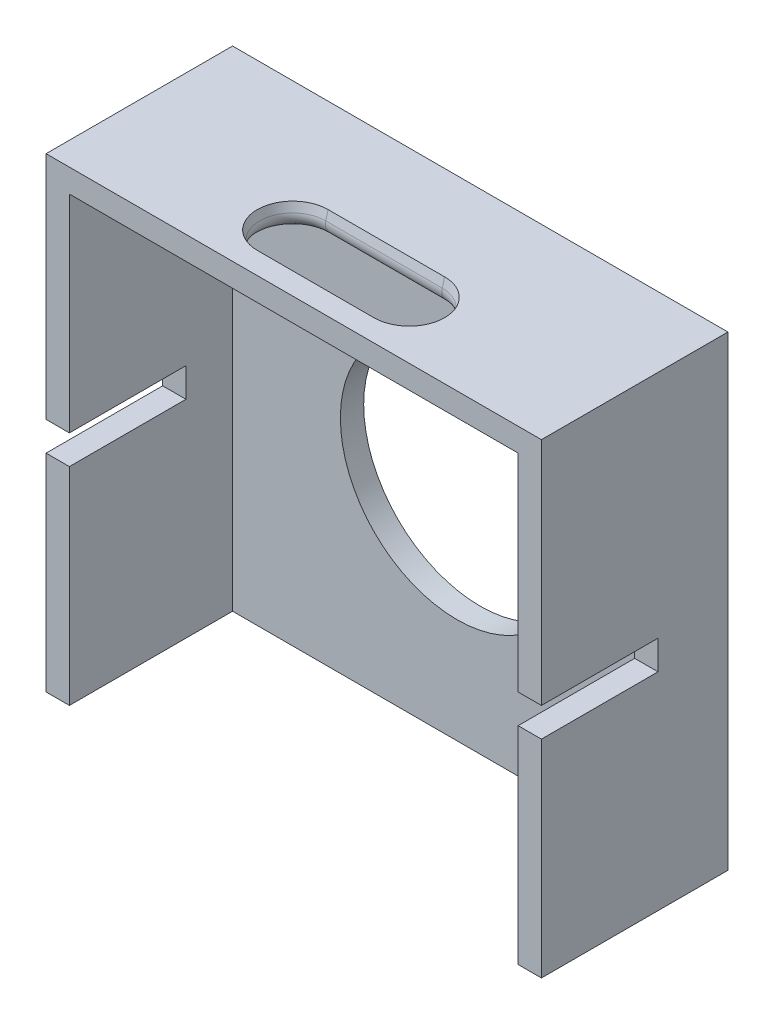
ISO-10303-21;
HEADER;
FILE_DESCRIPTION(('STEP AP214'),'2;1');
FILE_NAME('part.step','',(''),(''),'','','');
FILE_SCHEMA(('AUTOMOTIVE_DESIGN { 1 0 10303 214 1 1 1 1 }'));
ENDSEC;
DATA;
#1=APPLICATION_CONTEXT('core data for automotive mechanical design processes');
#2=APPLICATION_PROTOCOL_DEFINITION('international standard','automotive_design',2000,#1);
#3=PRODUCT_CONTEXT('',#1,'mechanical');
#4=PRODUCT('Part','Part','',(#3));
#5=PRODUCT_RELATED_PRODUCT_CATEGORY('part','',(#4));
#6=PRODUCT_DEFINITION_FORMATION('','',#4);
#7=PRODUCT_DEFINITION_CONTEXT('part definition',#1,'design');
#8=PRODUCT_DEFINITION('design','',#6,#7);
#9=PRODUCT_DEFINITION_SHAPE('','',#8);
#10=(LENGTH_UNIT() NAMED_UNIT(*) SI_UNIT(.MILLI.,.METRE.));
#11=(NAMED_UNIT(*) PLANE_ANGLE_UNIT() SI_UNIT($,.RADIAN.));
#12=(NAMED_UNIT(*) SI_UNIT($,.STERADIAN.) SOLID_ANGLE_UNIT());
#13=UNCERTAINTY_MEASURE_WITH_UNIT(LENGTH_MEASURE(1.E-05),#10,'distance_accuracy_value','');
#14=(GEOMETRIC_REPRESENTATION_CONTEXT(3) GLOBAL_UNCERTAINTY_ASSIGNED_CONTEXT((#13)) GLOBAL_UNIT_ASSIGNED_CONTEXT((#10,
#11,#12)) REPRESENTATION_CONTEXT('',''));
#15=CARTESIAN_POINT('',(0.,0.,0.));
#16=DIRECTION('',(0.,0.,1.));
#17=DIRECTION('',(1.,0.,0.));
#18=AXIS2_PLACEMENT_3D('',#15,#16,#17);
#19=CARTESIAN_POINT('',(19.25,0.,-58.3630876496438));
#20=DIRECTION('',(1.,0.,0.));
#21=DIRECTION('',(0.,1.,0.));
#22=AXIS2_PLACEMENT_3D('',#19,#20,#21);
#23=PLANE('',#22);
#24=DIRECTION('',(0.,0.,1.));
#25=VECTOR('',#24,1.);
#26=CARTESIAN_POINT('',(19.25,1.25,6.));
#27=LINE('',#26,#25);
#28=CARTESIAN_POINT('',(19.25,1.25,6.));
#29=VERTEX_POINT('',#28);
#30=CARTESIAN_POINT('',(19.25,1.25,16.));
#31=VERTEX_POINT('',#30);
#32=EDGE_CURVE('E229',#29,#31,#27,.T.);
#33=ORIENTED_EDGE('',*,*,#32,.T.);
#34=DIRECTION('',(0.,1.,0.));
#35=VECTOR('',#34,1.);
#36=CARTESIAN_POINT('',(19.25,0.,16.));
#37=LINE('',#36,#35);
#38=CARTESIAN_POINT('',(19.25,19.,16.));
#39=VERTEX_POINT('',#38);
#40=EDGE_CURVE('E272',#31,#39,#37,.T.);
#41=ORIENTED_EDGE('',*,*,#40,.T.);
#42=DIRECTION('',(0.,0.,1.));
#43=VECTOR('',#42,1.);
#44=CARTESIAN_POINT('',(19.25,19.,-58.3630876496438));
#45=LINE('',#44,#43);
#46=CARTESIAN_POINT('',(19.25,19.,2.));
#47=VERTEX_POINT('',#46);
#48=EDGE_CURVE('E297',#47,#39,#45,.T.);
#49=ORIENTED_EDGE('',*,*,#48,.F.);
#50=DIRECTION('',(0.,-1.,0.));
#51=VECTOR('',#50,1.);
#52=CARTESIAN_POINT('',(19.25,0.,2.));
#53=LINE('',#52,#51);
#54=CARTESIAN_POINT('',(19.25,-19.,2.));
#55=VERTEX_POINT('',#54);
#56=EDGE_CURVE('E330',#47,#55,#53,.T.);
#57=ORIENTED_EDGE('',*,*,#56,.T.);
#58=DIRECTION('',(0.,0.,1.));
#59=VECTOR('',#58,1.);
#60=CARTESIAN_POINT('',(19.25,-19.,-58.3630876496438));
#61=LINE('',#60,#59);
#62=CARTESIAN_POINT('',(19.25,-19.,16.));
#63=VERTEX_POINT('',#62);
#64=EDGE_CURVE('E323',#55,#63,#61,.T.);
#65=ORIENTED_EDGE('',*,*,#64,.T.);
#66=CARTESIAN_POINT('',(19.25,-1.25,16.));
#67=VERTEX_POINT('',#66);
#68=EDGE_CURVE('E273',#63,#67,#37,.T.);
#69=ORIENTED_EDGE('',*,*,#68,.T.);
#70=DIRECTION('',(0.,0.,-1.));
#71=VECTOR('',#70,1.);
#72=CARTESIAN_POINT('',(19.25,-1.25,6.));
#73=LINE('',#72,#71);
#74=CARTESIAN_POINT('',(19.25,-1.25,6.));
#75=VERTEX_POINT('',#74);
#76=EDGE_CURVE('E226',#67,#75,#73,.T.);
#77=ORIENTED_EDGE('',*,*,#76,.T.);
#78=DIRECTION('',(0.,1.,0.));
#79=VECTOR('',#78,1.);
#80=CARTESIAN_POINT('',(19.25,1.25,6.));
#81=LINE('',#80,#79);
#82=EDGE_CURVE('E223',#75,#29,#81,.T.);
#83=ORIENTED_EDGE('',*,*,#82,.T.);
#84=EDGE_LOOP('',(#33,#41,#49,#57,#65,#69,#77,#83));
#85=FACE_BOUND('',#84,.T.);
#86=ADVANCED_FACE('F35',(#85),#23,.F.);
#87=CARTESIAN_POINT('',(21.25,0.,-58.3630876496438));
#88=DIRECTION('',(1.,0.,0.));
#89=DIRECTION('',(0.,1.,0.));
#90=AXIS2_PLACEMENT_3D('',#87,#88,#89);
#91=PLANE('',#90);
#92=DIRECTION('',(0.,1.,0.));
#93=VECTOR('',#92,1.);
#94=CARTESIAN_POINT('',(21.25,0.,16.));
#95=LINE('',#94,#93);
#96=CARTESIAN_POINT('',(21.25,1.25,16.));
#97=VERTEX_POINT('',#96);
#98=CARTESIAN_POINT('',(21.25,21.,16.));
#99=VERTEX_POINT('',#98);
#100=EDGE_CURVE('E279',#97,#99,#95,.T.);
#101=ORIENTED_EDGE('',*,*,#100,.F.);
#102=DIRECTION('',(0.,0.,1.));
#103=VECTOR('',#102,1.);
#104=CARTESIAN_POINT('',(21.25,1.25,6.));
#105=LINE('',#104,#103);
#106=CARTESIAN_POINT('',(21.25,1.25,6.));
#107=VERTEX_POINT('',#106);
#108=EDGE_CURVE('E221',#107,#97,#105,.T.);
#109=ORIENTED_EDGE('',*,*,#108,.F.);
#110=DIRECTION('',(0.,1.,0.));
#111=VECTOR('',#110,1.);
#112=CARTESIAN_POINT('',(21.25,1.25,6.));
#113=LINE('',#112,#111);
#114=CARTESIAN_POINT('',(21.25,-1.25,6.));
#115=VERTEX_POINT('',#114);
#116=EDGE_CURVE('E196',#115,#107,#113,.T.);
#117=ORIENTED_EDGE('',*,*,#116,.F.);
#118=DIRECTION('',(0.,0.,-1.));
#119=VECTOR('',#118,1.);
#120=CARTESIAN_POINT('',(21.25,-1.25,6.));
#121=LINE('',#120,#119);
#122=CARTESIAN_POINT('',(21.25,-1.25,16.));
#123=VERTEX_POINT('',#122);
#124=EDGE_CURVE('E235',#123,#115,#121,.T.);
#125=ORIENTED_EDGE('',*,*,#124,.F.);
#126=CARTESIAN_POINT('',(21.25,-19.,16.));
#127=VERTEX_POINT('',#126);
#128=EDGE_CURVE('E280',#127,#123,#95,.T.);
#129=ORIENTED_EDGE('',*,*,#128,.F.);
#130=DIRECTION('',(0.,0.,1.));
#131=VECTOR('',#130,1.);
#132=CARTESIAN_POINT('',(21.25,-19.,-58.3630876496438));
#133=LINE('',#132,#131);
#134=CARTESIAN_POINT('',(21.25,-19.,0.));
#135=VERTEX_POINT('',#134);
#136=EDGE_CURVE('E321',#135,#127,#133,.T.);
#137=ORIENTED_EDGE('',*,*,#136,.F.);
#138=DIRECTION('',(0.,-1.,0.));
#139=VECTOR('',#138,1.);
#140=CARTESIAN_POINT('',(21.25,0.,0.));
#141=LINE('',#140,#139);
#142=CARTESIAN_POINT('',(21.25,21.,0.));
#143=VERTEX_POINT('',#142);
#144=EDGE_CURVE('E298',#143,#135,#141,.T.);
#145=ORIENTED_EDGE('',*,*,#144,.F.);
#146=DIRECTION('',(0.,0.,1.));
#147=VECTOR('',#146,1.);
#148=CARTESIAN_POINT('',(21.25,21.,-58.3630876496438));
#149=LINE('',#148,#147);
#150=EDGE_CURVE('E318',#143,#99,#149,.T.);
#151=ORIENTED_EDGE('',*,*,#150,.T.);
#152=EDGE_LOOP('',(#101,#109,#117,#125,#129,#137,#145,#151));
#153=FACE_BOUND('',#152,.T.);
#154=ADVANCED_FACE('F392',(#153),#91,.T.);
#155=CARTESIAN_POINT('',(0.,0.,16.));
#156=DIRECTION('',(0.,0.,1.));
#157=DIRECTION('',(1.,0.,0.));
#158=AXIS2_PLACEMENT_3D('',#155,#156,#157);
#159=PLANE('',#158);
#160=ORIENTED_EDGE('',*,*,#40,.F.);
#161=DIRECTION('',(-1.,0.,0.));
#162=VECTOR('',#161,1.);
#163=CARTESIAN_POINT('',(21.251,1.25,16.));
#164=LINE('',#163,#162);
#165=EDGE_CURVE('E236',#97,#31,#164,.T.);
#166=ORIENTED_EDGE('',*,*,#165,.F.);
#167=ORIENTED_EDGE('',*,*,#100,.T.);
#168=DIRECTION('',(1.,0.,0.));
#169=VECTOR('',#168,1.);
#170=CARTESIAN_POINT('',(0.,21.,16.));
#171=LINE('',#170,#169);
#172=CARTESIAN_POINT('',(-21.25,21.,16.));
#173=VERTEX_POINT('',#172);
#174=EDGE_CURVE('E283',#173,#99,#171,.T.);
#175=ORIENTED_EDGE('',*,*,#174,.F.);
#176=DIRECTION('',(0.,1.,0.));
#177=VECTOR('',#176,1.);
#178=CARTESIAN_POINT('',(-21.25,0.,16.));
#179=LINE('',#178,#177);
#180=CARTESIAN_POINT('',(-21.25,1.25,16.));
#181=VERTEX_POINT('',#180);
#182=EDGE_CURVE('E286',#181,#173,#179,.T.);
#183=ORIENTED_EDGE('',*,*,#182,.F.);
#184=DIRECTION('',(1.,0.,0.));
#185=VECTOR('',#184,1.);
#186=CARTESIAN_POINT('',(-21.251,1.25,16.));
#187=LINE('',#186,#185);
#188=CARTESIAN_POINT('',(-19.25,1.25,16.));
#189=VERTEX_POINT('',#188);
#190=EDGE_CURVE('E263',#181,#189,#187,.T.);
#191=ORIENTED_EDGE('',*,*,#190,.T.);
#192=DIRECTION('',(0.,-1.,0.));
#193=VECTOR('',#192,1.);
#194=CARTESIAN_POINT('',(-19.25,0.,16.));
#195=LINE('',#194,#193);
#196=CARTESIAN_POINT('',(-19.25,19.,16.));
#197=VERTEX_POINT('',#196);
#198=EDGE_CURVE('E294',#197,#189,#195,.T.);
#199=ORIENTED_EDGE('',*,*,#198,.F.);
#200=DIRECTION('',(-1.,0.,0.));
#201=VECTOR('',#200,1.);
#202=CARTESIAN_POINT('',(0.,19.,16.));
#203=LINE('',#202,#201);
#204=EDGE_CURVE('E269',#39,#197,#203,.T.);
#205=ORIENTED_EDGE('',*,*,#204,.F.);
#206=EDGE_LOOP('',(#160,#166,#167,#175,#183,#191,#199,#205));
#207=FACE_BOUND('',#206,.T.);
#208=ADVANCED_FACE('F399',(#207),#159,.T.);
#209=ORIENTED_EDGE('',*,*,#128,.T.);
#210=DIRECTION('',(-1.,0.,0.));
#211=VECTOR('',#210,1.);
#212=CARTESIAN_POINT('',(21.251,-1.25,16.));
#213=LINE('',#212,#211);
#214=EDGE_CURVE('E238',#123,#67,#213,.T.);
#215=ORIENTED_EDGE('',*,*,#214,.T.);
#216=ORIENTED_EDGE('',*,*,#68,.F.);
#217=DIRECTION('',(1.,0.,0.));
#218=VECTOR('',#217,1.);
#219=CARTESIAN_POINT('',(0.,-19.,16.));
#220=LINE('',#219,#218);
#221=EDGE_CURVE('E276',#63,#127,#220,.T.);
#222=ORIENTED_EDGE('',*,*,#221,.T.);
#223=EDGE_LOOP('',(#209,#215,#216,#222));
#224=FACE_BOUND('',#223,.T.);
#225=ADVANCED_FACE('F506',(#224),#159,.T.);
#226=DIRECTION('',(1.,0.,0.));
#227=VECTOR('',#226,1.);
#228=CARTESIAN_POINT('',(-21.251,-1.25,16.));
#229=LINE('',#228,#227);
#230=CARTESIAN_POINT('',(-21.25,-1.25,16.));
#231=VERTEX_POINT('',#230);
#232=CARTESIAN_POINT('',(-19.25,-1.25,16.));
#233=VERTEX_POINT('',#232);
#234=EDGE_CURVE('E261',#231,#233,#229,.T.);
#235=ORIENTED_EDGE('',*,*,#234,.F.);
#236=CARTESIAN_POINT('',(-21.25,-19.,16.));
#237=VERTEX_POINT('',#236);
#238=EDGE_CURVE('E287',#237,#231,#179,.T.);
#239=ORIENTED_EDGE('',*,*,#238,.F.);
#240=DIRECTION('',(-1.,0.,0.));
#241=VECTOR('',#240,1.);
#242=CARTESIAN_POINT('',(0.,-19.,16.));
#243=LINE('',#242,#241);
#244=CARTESIAN_POINT('',(-19.25,-19.,16.));
#245=VERTEX_POINT('',#244);
#246=EDGE_CURVE('E290',#245,#237,#243,.T.);
#247=ORIENTED_EDGE('',*,*,#246,.F.);
#248=EDGE_CURVE('E293',#233,#245,#195,.T.);
#249=ORIENTED_EDGE('',*,*,#248,.F.);
#250=EDGE_LOOP('',(#235,#239,#247,#249));
#251=FACE_BOUND('',#250,.T.);
#252=ADVANCED_FACE('F423',(#251),#159,.T.);
#253=CARTESIAN_POINT('',(0.,0.,2.));
#254=DIRECTION('',(0.,0.,-1.));
#255=DIRECTION('',(-1.,0.,0.));
#256=AXIS2_PLACEMENT_3D('',#253,#254,#255);
#257=CYLINDRICAL_SURFACE('',#256,10.);
#258=CARTESIAN_POINT('',(0.,0.,2.));
#259=DIRECTION('',(0.,0.,1.));
#260=DIRECTION('',(1.,0.,0.));
#261=AXIS2_PLACEMENT_3D('',#258,#259,#260);
#262=CIRCLE('',#261,10.);
#263=CARTESIAN_POINT('',(10.,0.,2.));
#264=VERTEX_POINT('',#263);
#265=EDGE_CURVE('E327',#264,#264,#262,.T.);
#266=ORIENTED_EDGE('',*,*,#265,.T.);
#267=EDGE_LOOP('',(#266));
#268=FACE_BOUND('',#267,.T.);
#269=CARTESIAN_POINT('',(0.,0.,0.));
#270=DIRECTION('',(0.,0.,1.));
#271=DIRECTION('',(1.,0.,0.));
#272=AXIS2_PLACEMENT_3D('',#269,#270,#271);
#273=CIRCLE('',#272,10.);
#274=CARTESIAN_POINT('',(10.,0.,0.));
#275=VERTEX_POINT('',#274);
#276=EDGE_CURVE('E308',#275,#275,#273,.T.);
#277=ORIENTED_EDGE('',*,*,#276,.F.);
#278=EDGE_LOOP('',(#277));
#279=FACE_BOUND('',#278,.T.);
#280=ADVANCED_FACE('F419',(#268,#279),#257,.F.);
#281=CARTESIAN_POINT('',(0.,-19.,2.));
#282=DIRECTION('',(0.,1.,0.));
#283=DIRECTION('',(0.,0.,1.));
#284=AXIS2_PLACEMENT_3D('',#281,#282,#283);
#285=PLANE('',#284);
#286=DIRECTION('',(1.,0.,0.));
#287=VECTOR('',#286,1.);
#288=CARTESIAN_POINT('',(0.,-19.,0.));
#289=LINE('',#288,#287);
#290=CARTESIAN_POINT('',(-21.25,-19.,0.));
#291=VERTEX_POINT('',#290);
#292=EDGE_CURVE('E331',#291,#135,#289,.T.);
#293=ORIENTED_EDGE('',*,*,#292,.T.);
#294=ORIENTED_EDGE('',*,*,#136,.T.);
#295=ORIENTED_EDGE('',*,*,#221,.F.);
#296=ORIENTED_EDGE('',*,*,#64,.F.);
#297=DIRECTION('',(1.,0.,0.));
#298=VECTOR('',#297,1.);
#299=CARTESIAN_POINT('',(0.,-19.,2.));
#300=LINE('',#299,#298);
#301=CARTESIAN_POINT('',(-19.25,-19.,2.));
#302=VERTEX_POINT('',#301);
#303=EDGE_CURVE('E338',#302,#55,#300,.T.);
#304=ORIENTED_EDGE('',*,*,#303,.F.);
#305=DIRECTION('',(0.,0.,1.));
#306=VECTOR('',#305,1.);
#307=CARTESIAN_POINT('',(-19.25,-19.,-58.3630876496438));
#308=LINE('',#307,#306);
#309=EDGE_CURVE('E310',#302,#245,#308,.T.);
#310=ORIENTED_EDGE('',*,*,#309,.T.);
#311=ORIENTED_EDGE('',*,*,#246,.T.);
#312=DIRECTION('',(0.,0.,1.));
#313=VECTOR('',#312,1.);
#314=CARTESIAN_POINT('',(-21.25,-19.,-58.3630876496438));
#315=LINE('',#314,#313);
#316=EDGE_CURVE('E313',#291,#237,#315,.T.);
#317=ORIENTED_EDGE('',*,*,#316,.F.);
#318=EDGE_LOOP('',(#293,#294,#295,#296,#304,#310,#311,#317));
#319=FACE_BOUND('',#318,.T.);
#320=ADVANCED_FACE('F412',(#319),#285,.F.);
#321=CARTESIAN_POINT('',(0.,0.,2.));
#322=DIRECTION('',(0.,0.,1.));
#323=DIRECTION('',(1.,0.,0.));
#324=AXIS2_PLACEMENT_3D('',#321,#322,#323);
#325=PLANE('',#324);
#326=ORIENTED_EDGE('',*,*,#265,.F.);
#327=EDGE_LOOP('',(#326));
#328=FACE_BOUND('',#327,.T.);
#329=ORIENTED_EDGE('',*,*,#56,.F.);
#330=DIRECTION('',(1.,0.,0.));
#331=VECTOR('',#330,1.);
#332=CARTESIAN_POINT('',(0.,19.,2.));
#333=LINE('',#332,#331);
#334=CARTESIAN_POINT('',(-19.25,19.,2.));
#335=VERTEX_POINT('',#334);
#336=EDGE_CURVE('E333',#335,#47,#333,.T.);
#337=ORIENTED_EDGE('',*,*,#336,.F.);
#338=DIRECTION('',(0.,-1.,0.));
#339=VECTOR('',#338,1.);
#340=CARTESIAN_POINT('',(-19.25,0.,2.));
#341=LINE('',#340,#339);
#342=EDGE_CURVE('E335',#335,#302,#341,.T.);
#343=ORIENTED_EDGE('',*,*,#342,.T.);
#344=ORIENTED_EDGE('',*,*,#303,.T.);
#345=EDGE_LOOP('',(#329,#337,#343,#344));
#346=FACE_BOUND('',#345,.T.);
#347=ADVANCED_FACE('F408',(#328,#346),#325,.T.);
#348=CARTESIAN_POINT('',(0.,0.,0.));
#349=DIRECTION('',(0.,0.,1.));
#350=DIRECTION('',(1.,0.,0.));
#351=AXIS2_PLACEMENT_3D('',#348,#349,#350);
#352=PLANE('',#351);
#353=ORIENTED_EDGE('',*,*,#144,.T.);
#354=ORIENTED_EDGE('',*,*,#292,.F.);
#355=DIRECTION('',(0.,-1.,0.));
#356=VECTOR('',#355,1.);
#357=CARTESIAN_POINT('',(-21.25,0.,0.));
#358=LINE('',#357,#356);
#359=CARTESIAN_POINT('',(-21.25,21.,0.));
#360=VERTEX_POINT('',#359);
#361=EDGE_CURVE('E305',#360,#291,#358,.T.);
#362=ORIENTED_EDGE('',*,*,#361,.F.);
#363=DIRECTION('',(-1.,0.,0.));
#364=VECTOR('',#363,1.);
#365=CARTESIAN_POINT('',(0.,21.,0.));
#366=LINE('',#365,#364);
#367=EDGE_CURVE('E301',#143,#360,#366,.T.);
#368=ORIENTED_EDGE('',*,*,#367,.F.);
#369=EDGE_LOOP('',(#353,#354,#362,#368));
#370=FACE_BOUND('',#369,.T.);
#371=ORIENTED_EDGE('',*,*,#276,.T.);
#372=EDGE_LOOP('',(#371));
#373=FACE_BOUND('',#372,.T.);
#374=ADVANCED_FACE('F411',(#370,#373),#352,.F.);
#375=CARTESIAN_POINT('',(0.,21.,-58.3630876496438));
#376=DIRECTION('',(0.,-1.,0.));
#377=DIRECTION('',(1.,0.,0.));
#378=AXIS2_PLACEMENT_3D('',#375,#376,#377);
#379=PLANE('',#378);
#380=DIRECTION('',(-1.,0.,0.));
#381=VECTOR('',#380,1.);
#382=CARTESIAN_POINT('',(-5.,21.,14.1269330410544));
#383=LINE('',#382,#381);
#384=CARTESIAN_POINT('',(5.,21.,14.1269330410517));
#385=VERTEX_POINT('',#384);
#386=CARTESIAN_POINT('',(-5.,21.,14.1269330410544));
#387=VERTEX_POINT('',#386);
#388=EDGE_CURVE('E189',#385,#387,#383,.T.);
#389=ORIENTED_EDGE('',*,*,#388,.T.);
#390=CARTESIAN_POINT('',(-5.,21.,11.0910346561894));
#391=DIRECTION('',(0.,-1.,0.));
#392=DIRECTION('',(0.,0.,-1.));
#393=AXIS2_PLACEMENT_3D('',#390,#391,#392);
#394=CIRCLE('',#393,3.03589838486225);
#395=CARTESIAN_POINT('',(-5.,21.,8.05513627132719));
#396=VERTEX_POINT('',#395);
#397=EDGE_CURVE('E200',#387,#396,#394,.T.);
#398=ORIENTED_EDGE('',*,*,#397,.T.);
#399=DIRECTION('',(1.,0.,0.));
#400=VECTOR('',#399,1.);
#401=CARTESIAN_POINT('',(-5.,21.,8.05513627132987));
#402=LINE('',#401,#400);
#403=CARTESIAN_POINT('',(5.,21.,8.05513627132987));
#404=VERTEX_POINT('',#403);
#405=EDGE_CURVE('E206',#396,#404,#402,.T.);
#406=ORIENTED_EDGE('',*,*,#405,.T.);
#407=CARTESIAN_POINT('',(5.,21.,11.0910346561894));
#408=DIRECTION('',(0.,-1.,0.));
#409=DIRECTION('',(0.,0.,-1.));
#410=AXIS2_PLACEMENT_3D('',#407,#408,#409);
#411=CIRCLE('',#410,3.03589838486225);
#412=EDGE_CURVE('E210',#404,#385,#411,.T.);
#413=ORIENTED_EDGE('',*,*,#412,.T.);
#414=EDGE_LOOP('',(#389,#398,#406,#413));
#415=FACE_BOUND('',#414,.T.);
#416=ORIENTED_EDGE('',*,*,#150,.F.);
#417=ORIENTED_EDGE('',*,*,#367,.T.);
#418=DIRECTION('',(0.,0.,1.));
#419=VECTOR('',#418,1.);
#420=CARTESIAN_POINT('',(-21.25,21.,-58.3630876496438));
#421=LINE('',#420,#419);
#422=EDGE_CURVE('E315',#360,#173,#421,.T.);
#423=ORIENTED_EDGE('',*,*,#422,.T.);
#424=ORIENTED_EDGE('',*,*,#174,.T.);
#425=EDGE_LOOP('',(#416,#417,#423,#424));
#426=FACE_BOUND('',#425,.T.);
#427=ADVANCED_FACE('F208',(#415,#426),#379,.F.);
#428=CARTESIAN_POINT('',(-21.25,0.,-58.3630876496438));
#429=DIRECTION('',(1.,0.,0.));
#430=DIRECTION('',(0.,0.,-1.));
#431=AXIS2_PLACEMENT_3D('',#428,#429,#430);
#432=PLANE('',#431);
#433=ORIENTED_EDGE('',*,*,#238,.T.);
#434=DIRECTION('',(0.,0.,1.));
#435=VECTOR('',#434,1.);
#436=CARTESIAN_POINT('',(-21.25,-1.25,6.));
#437=LINE('',#436,#435);
#438=CARTESIAN_POINT('',(-21.25,-1.25,6.));
#439=VERTEX_POINT('',#438);
#440=EDGE_CURVE('E247',#439,#231,#437,.T.);
#441=ORIENTED_EDGE('',*,*,#440,.F.);
#442=DIRECTION('',(0.,-1.,0.));
#443=VECTOR('',#442,1.);
#444=CARTESIAN_POINT('',(-21.25,1.25,6.));
#445=LINE('',#444,#443);
#446=CARTESIAN_POINT('',(-21.25,1.25,6.));
#447=VERTEX_POINT('',#446);
#448=EDGE_CURVE('E244',#447,#439,#445,.T.);
#449=ORIENTED_EDGE('',*,*,#448,.F.);
#450=DIRECTION('',(0.,0.,-1.));
#451=VECTOR('',#450,1.);
#452=CARTESIAN_POINT('',(-21.25,1.25,6.));
#453=LINE('',#452,#451);
#454=EDGE_CURVE('E260',#181,#447,#453,.T.);
#455=ORIENTED_EDGE('',*,*,#454,.F.);
#456=ORIENTED_EDGE('',*,*,#182,.T.);
#457=ORIENTED_EDGE('',*,*,#422,.F.);
#458=ORIENTED_EDGE('',*,*,#361,.T.);
#459=ORIENTED_EDGE('',*,*,#316,.T.);
#460=EDGE_LOOP('',(#433,#441,#449,#455,#456,#457,#458,#459));
#461=FACE_BOUND('',#460,.T.);
#462=ADVANCED_FACE('F473',(#461),#432,.F.);
#463=CARTESIAN_POINT('',(-19.25,0.,-58.3630876496438));
#464=DIRECTION('',(-1.,0.,0.));
#465=DIRECTION('',(0.,-1.,0.));
#466=AXIS2_PLACEMENT_3D('',#463,#464,#465);
#467=PLANE('',#466);
#468=DIRECTION('',(0.,1.,0.));
#469=VECTOR('',#468,1.);
#470=CARTESIAN_POINT('',(-19.25,1.25,6.));
#471=LINE('',#470,#469);
#472=CARTESIAN_POINT('',(-19.25,-1.25,6.));
#473=VERTEX_POINT('',#472);
#474=CARTESIAN_POINT('',(-19.25,1.25,6.));
#475=VERTEX_POINT('',#474);
#476=EDGE_CURVE('E249',#473,#475,#471,.T.);
#477=ORIENTED_EDGE('',*,*,#476,.F.);
#478=DIRECTION('',(0.,0.,-1.));
#479=VECTOR('',#478,1.);
#480=CARTESIAN_POINT('',(-19.25,-1.25,6.));
#481=LINE('',#480,#479);
#482=EDGE_CURVE('E254',#233,#473,#481,.T.);
#483=ORIENTED_EDGE('',*,*,#482,.F.);
#484=ORIENTED_EDGE('',*,*,#248,.T.);
#485=ORIENTED_EDGE('',*,*,#309,.F.);
#486=ORIENTED_EDGE('',*,*,#342,.F.);
#487=DIRECTION('',(0.,0.,1.));
#488=VECTOR('',#487,1.);
#489=CARTESIAN_POINT('',(-19.25,19.,-58.3630876496438));
#490=LINE('',#489,#488);
#491=EDGE_CURVE('E302',#335,#197,#490,.T.);
#492=ORIENTED_EDGE('',*,*,#491,.T.);
#493=ORIENTED_EDGE('',*,*,#198,.T.);
#494=DIRECTION('',(0.,0.,1.));
#495=VECTOR('',#494,1.);
#496=CARTESIAN_POINT('',(-19.25,1.25,6.));
#497=LINE('',#496,#495);
#498=EDGE_CURVE('E252',#475,#189,#497,.T.);
#499=ORIENTED_EDGE('',*,*,#498,.F.);
#500=EDGE_LOOP('',(#477,#483,#484,#485,#486,#492,#493,#499));
#501=FACE_BOUND('',#500,.T.);
#502=ADVANCED_FACE('F407',(#501),#467,.F.);
#503=CARTESIAN_POINT('',(0.,19.,-58.3630876496438));
#504=DIRECTION('',(0.,1.,0.));
#505=DIRECTION('',(0.,0.,1.));
#506=AXIS2_PLACEMENT_3D('',#503,#504,#505);
#507=PLANE('',#506);
#508=DIRECTION('',(1.,0.,0.));
#509=VECTOR('',#508,1.);
#510=CARTESIAN_POINT('',(0.,19.,7.2878092833509));
#511=LINE('',#510,#509);
#512=CARTESIAN_POINT('',(5.,19.,7.28780928335091));
#513=VERTEX_POINT('',#512);
#514=CARTESIAN_POINT('',(-5.,19.,7.28780928335091));
#515=VERTEX_POINT('',#514);
#516=EDGE_CURVE('E346',#513,#515,#511,.F.);
#517=ORIENTED_EDGE('',*,*,#516,.T.);
#518=CARTESIAN_POINT('',(-5.,19.,11.0910346561894));
#519=DIRECTION('',(0.,1.,0.));
#520=DIRECTION('',(0.,0.,1.));
#521=AXIS2_PLACEMENT_3D('',#518,#519,#520);
#522=CIRCLE('',#521,3.80322537284121);
#523=CARTESIAN_POINT('',(-5.,19.,14.8942600290333));
#524=VERTEX_POINT('',#523);
#525=EDGE_CURVE('E352',#515,#524,#522,.T.);
#526=ORIENTED_EDGE('',*,*,#525,.T.);
#527=DIRECTION('',(-1.,0.,0.));
#528=VECTOR('',#527,1.);
#529=CARTESIAN_POINT('',(0.,19.,14.8942600290333));
#530=LINE('',#529,#528);
#531=CARTESIAN_POINT('',(5.,19.,14.8942600290306));
#532=VERTEX_POINT('',#531);
#533=EDGE_CURVE('E350',#524,#532,#530,.F.);
#534=ORIENTED_EDGE('',*,*,#533,.T.);
#535=CARTESIAN_POINT('',(5.,19.,11.0910346561894));
#536=DIRECTION('',(0.,1.,0.));
#537=DIRECTION('',(0.,0.,1.));
#538=AXIS2_PLACEMENT_3D('',#535,#536,#537);
#539=CIRCLE('',#538,3.80322537284121);
#540=EDGE_CURVE('E348',#532,#513,#539,.T.);
#541=ORIENTED_EDGE('',*,*,#540,.T.);
#542=EDGE_LOOP('',(#517,#526,#534,#541));
#543=FACE_BOUND('',#542,.T.);
#544=ORIENTED_EDGE('',*,*,#336,.T.);
#545=ORIENTED_EDGE('',*,*,#48,.T.);
#546=ORIENTED_EDGE('',*,*,#204,.T.);
#547=ORIENTED_EDGE('',*,*,#491,.F.);
#548=EDGE_LOOP('',(#544,#545,#546,#547));
#549=FACE_BOUND('',#548,.T.);
#550=ADVANCED_FACE('F373',(#543,#549),#507,.F.);
#551=CARTESIAN_POINT('',(-21.251,1.25,6.));
#552=DIRECTION('',(0.,0.,-1.));
#553=DIRECTION('',(-1.,0.,0.));
#554=AXIS2_PLACEMENT_3D('',#551,#552,#553);
#555=PLANE('',#554);
#556=ORIENTED_EDGE('',*,*,#448,.T.);
#557=DIRECTION('',(1.,0.,0.));
#558=VECTOR('',#557,1.);
#559=CARTESIAN_POINT('',(-21.251,-1.25,6.));
#560=LINE('',#559,#558);
#561=EDGE_CURVE('E258',#439,#473,#560,.T.);
#562=ORIENTED_EDGE('',*,*,#561,.T.);
#563=ORIENTED_EDGE('',*,*,#476,.T.);
#564=DIRECTION('',(1.,0.,0.));
#565=VECTOR('',#564,1.);
#566=CARTESIAN_POINT('',(-21.251,1.25,6.));
#567=LINE('',#566,#565);
#568=EDGE_CURVE('E257',#447,#475,#567,.T.);
#569=ORIENTED_EDGE('',*,*,#568,.F.);
#570=EDGE_LOOP('',(#556,#562,#563,#569));
#571=FACE_BOUND('',#570,.T.);
#572=ADVANCED_FACE('F406',(#571),#555,.F.);
#573=CARTESIAN_POINT('',(-21.251,-1.25,6.));
#574=DIRECTION('',(0.,-1.,0.));
#575=DIRECTION('',(0.,0.,-1.));
#576=AXIS2_PLACEMENT_3D('',#573,#574,#575);
#577=PLANE('',#576);
#578=ORIENTED_EDGE('',*,*,#440,.T.);
#579=ORIENTED_EDGE('',*,*,#234,.T.);
#580=ORIENTED_EDGE('',*,*,#482,.T.);
#581=ORIENTED_EDGE('',*,*,#561,.F.);
#582=EDGE_LOOP('',(#578,#579,#580,#581));
#583=FACE_BOUND('',#582,.T.);
#584=ADVANCED_FACE('F539',(#583),#577,.F.);
#585=CARTESIAN_POINT('',(-21.251,1.25,6.));
#586=DIRECTION('',(0.,1.,0.));
#587=DIRECTION('',(0.,0.,1.));
#588=AXIS2_PLACEMENT_3D('',#585,#586,#587);
#589=PLANE('',#588);
#590=ORIENTED_EDGE('',*,*,#454,.T.);
#591=ORIENTED_EDGE('',*,*,#568,.T.);
#592=ORIENTED_EDGE('',*,*,#498,.T.);
#593=ORIENTED_EDGE('',*,*,#190,.F.);
#594=EDGE_LOOP('',(#590,#591,#592,#593));
#595=FACE_BOUND('',#594,.T.);
#596=ADVANCED_FACE('F499',(#595),#589,.F.);
#597=CARTESIAN_POINT('',(21.251,1.25,6.));
#598=DIRECTION('',(0.,0.,1.));
#599=DIRECTION('',(1.,0.,0.));
#600=AXIS2_PLACEMENT_3D('',#597,#598,#599);
#601=PLANE('',#600);
#602=ORIENTED_EDGE('',*,*,#116,.T.);
#603=DIRECTION('',(-1.,0.,0.));
#604=VECTOR('',#603,1.);
#605=CARTESIAN_POINT('',(21.251,1.25,6.));
#606=LINE('',#605,#604);
#607=EDGE_CURVE('E233',#107,#29,#606,.T.);
#608=ORIENTED_EDGE('',*,*,#607,.T.);
#609=ORIENTED_EDGE('',*,*,#82,.F.);
#610=DIRECTION('',(-1.,0.,0.));
#611=VECTOR('',#610,1.);
#612=CARTESIAN_POINT('',(21.251,-1.25,6.));
#613=LINE('',#612,#611);
#614=EDGE_CURVE('E232',#115,#75,#613,.T.);
#615=ORIENTED_EDGE('',*,*,#614,.F.);
#616=EDGE_LOOP('',(#602,#608,#609,#615));
#617=FACE_BOUND('',#616,.T.);
#618=ADVANCED_FACE('F489',(#617),#601,.T.);
#619=CARTESIAN_POINT('',(21.251,1.25,6.));
#620=DIRECTION('',(0.,-1.,0.));
#621=DIRECTION('',(0.,0.,-1.));
#622=AXIS2_PLACEMENT_3D('',#619,#620,#621);
#623=PLANE('',#622);
#624=ORIENTED_EDGE('',*,*,#108,.T.);
#625=ORIENTED_EDGE('',*,*,#165,.T.);
#626=ORIENTED_EDGE('',*,*,#32,.F.);
#627=ORIENTED_EDGE('',*,*,#607,.F.);
#628=EDGE_LOOP('',(#624,#625,#626,#627));
#629=FACE_BOUND('',#628,.T.);
#630=ADVANCED_FACE('F479',(#629),#623,.T.);
#631=CARTESIAN_POINT('',(21.251,-1.25,6.));
#632=DIRECTION('',(0.,1.,0.));
#633=DIRECTION('',(0.,0.,1.));
#634=AXIS2_PLACEMENT_3D('',#631,#632,#633);
#635=PLANE('',#634);
#636=ORIENTED_EDGE('',*,*,#124,.T.);
#637=ORIENTED_EDGE('',*,*,#614,.T.);
#638=ORIENTED_EDGE('',*,*,#76,.F.);
#639=ORIENTED_EDGE('',*,*,#214,.F.);
#640=EDGE_LOOP('',(#636,#637,#638,#639));
#641=FACE_BOUND('',#640,.T.);
#642=ADVANCED_FACE('F456',(#641),#635,.T.);
#643=CARTESIAN_POINT('',(-5.,19.,11.0910346561894));
#644=DIRECTION('',(0.,1.,0.));
#645=DIRECTION('',(0.,0.,-1.));
#646=AXIS2_PLACEMENT_3D('',#643,#644,#645);
#647=CONICAL_SURFACE('',#646,2.5,0.26179938779915);
#648=DIRECTION('',(0.,0.965925826289068,0.258819045102521));
#649=VECTOR('',#648,1.);
#650=CARTESIAN_POINT('',(-5.,19.,13.5910346561921));
#651=LINE('',#650,#649);
#652=CARTESIAN_POINT('',(-5.,20.2588190451025,13.9283342027443));
#653=VERTEX_POINT('',#652);
#654=EDGE_CURVE('E185',#387,#653,#651,.F.);
#655=ORIENTED_EDGE('',*,*,#654,.T.);
#656=CARTESIAN_POINT('',(-5.,20.2588190451025,11.0910346561894));
#657=DIRECTION('',(0.,-1.,0.));
#658=DIRECTION('',(0.,0.,-1.));
#659=AXIS2_PLACEMENT_3D('',#656,#657,#658);
#660=CIRCLE('',#659,2.83729954655214);
#661=CARTESIAN_POINT('',(-5.,20.2588190451019,8.25373510963748));
#662=VERTEX_POINT('',#661);
#663=EDGE_CURVE('E341',#653,#662,#660,.T.);
#664=ORIENTED_EDGE('',*,*,#663,.T.);
#665=DIRECTION('',(0.,0.965925826289068,-0.258819045102521));
#666=VECTOR('',#665,1.);
#667=CARTESIAN_POINT('',(-5.,18.9999999999993,8.59103465618962));
#668=LINE('',#667,#666);
#669=EDGE_CURVE('E202',#396,#662,#668,.F.);
#670=ORIENTED_EDGE('',*,*,#669,.F.);
#671=ORIENTED_EDGE('',*,*,#397,.F.);
#672=EDGE_LOOP('',(#655,#664,#670,#671));
#673=FACE_BOUND('',#672,.T.);
#674=ADVANCED_FACE('F201',(#673),#647,.F.);
#675=CARTESIAN_POINT('',(-5.,19.,13.5910346561921));
#676=DIRECTION('',(0.,-0.258819045102521,0.965925826289068));
#677=DIRECTION('',(0.,-0.965925826289068,-0.258819045102521));
#678=AXIS2_PLACEMENT_3D('',#675,#676,#677);
#679=PLANE('',#678);
#680=DIRECTION('',(0.,0.965925826289068,0.258819045102521));
#681=VECTOR('',#680,1.);
#682=CARTESIAN_POINT('',(5.,19.0000000000007,13.5910346561896));
#683=LINE('',#682,#681);
#684=CARTESIAN_POINT('',(5.,20.2588190451025,13.9283342027416));
#685=VERTEX_POINT('',#684);
#686=EDGE_CURVE('E197',#385,#685,#683,.F.);
#687=ORIENTED_EDGE('',*,*,#686,.T.);
#688=DIRECTION('',(-1.,0.,0.));
#689=VECTOR('',#688,1.);
#690=CARTESIAN_POINT('',(-5.,20.2588190451025,13.9283342027443));
#691=LINE('',#690,#689);
#692=EDGE_CURVE('E192',#685,#653,#691,.T.);
#693=ORIENTED_EDGE('',*,*,#692,.T.);
#694=ORIENTED_EDGE('',*,*,#654,.F.);
#695=ORIENTED_EDGE('',*,*,#388,.F.);
#696=EDGE_LOOP('',(#687,#693,#694,#695));
#697=FACE_BOUND('',#696,.T.);
#698=ADVANCED_FACE('F187',(#697),#679,.F.);
#699=CARTESIAN_POINT('',(5.,19.,11.0910346561894));
#700=DIRECTION('',(0.,1.,0.));
#701=DIRECTION('',(0.,0.,-1.));
#702=AXIS2_PLACEMENT_3D('',#699,#700,#701);
#703=CONICAL_SURFACE('',#702,2.5,0.26179938779915);
#704=DIRECTION('',(0.,0.965925826289068,-0.258819045102521));
#705=VECTOR('',#704,1.);
#706=CARTESIAN_POINT('',(5.,19.0000000000007,8.59103465619194));
#707=LINE('',#706,#705);
#708=CARTESIAN_POINT('',(5.,20.2588190451025,8.25373510963998));
#709=VERTEX_POINT('',#708);
#710=EDGE_CURVE('E212',#404,#709,#707,.F.);
#711=ORIENTED_EDGE('',*,*,#710,.T.);
#712=CARTESIAN_POINT('',(5.,20.2588190451025,11.0910346561894));
#713=DIRECTION('',(0.,-1.,0.));
#714=DIRECTION('',(0.,0.,-1.));
#715=AXIS2_PLACEMENT_3D('',#712,#713,#714);
#716=CIRCLE('',#715,2.83729954655214);
#717=EDGE_CURVE('E44',#709,#685,#716,.T.);
#718=ORIENTED_EDGE('',*,*,#717,.T.);
#719=ORIENTED_EDGE('',*,*,#686,.F.);
#720=ORIENTED_EDGE('',*,*,#412,.F.);
#721=EDGE_LOOP('',(#711,#718,#719,#720));
#722=FACE_BOUND('',#721,.T.);
#723=ADVANCED_FACE('F382',(#722),#703,.F.);
#724=CARTESIAN_POINT('',(-5.,19.,8.59103465619212));
#725=DIRECTION('',(0.,-0.258819045102521,-0.965925826289068));
#726=DIRECTION('',(0.,0.965925826289068,-0.258819045102521));
#727=AXIS2_PLACEMENT_3D('',#724,#725,#726);
#728=PLANE('',#727);
#729=ORIENTED_EDGE('',*,*,#669,.T.);
#730=DIRECTION('',(1.,0.,0.));
#731=VECTOR('',#730,1.);
#732=CARTESIAN_POINT('',(-5.,20.2588190451025,8.25373510963998));
#733=LINE('',#732,#731);
#734=EDGE_CURVE('E11',#662,#709,#733,.T.);
#735=ORIENTED_EDGE('',*,*,#734,.T.);
#736=ORIENTED_EDGE('',*,*,#710,.F.);
#737=ORIENTED_EDGE('',*,*,#405,.F.);
#738=EDGE_LOOP('',(#729,#735,#736,#737));
#739=FACE_BOUND('',#738,.T.);
#740=ADVANCED_FACE('F381',(#739),#728,.F.);
#741=CARTESIAN_POINT('',(5.,20.,11.0910346561894));
#742=DIRECTION('',(0.,1.,0.));
#743=DIRECTION('',(0.,0.,1.));
#744=AXIS2_PLACEMENT_3D('',#741,#742,#743);
#745=TOROIDAL_SURFACE('',#744,3.80322537284121,1.);
#746=CARTESIAN_POINT('',(5.,20.,7.28780928334823));
#747=DIRECTION('',(-1.,0.,0.));
#748=DIRECTION('',(0.,0.,1.));
#749=AXIS2_PLACEMENT_3D('',#746,#747,#748);
#750=CIRCLE('',#749,1.);
#751=EDGE_CURVE('E360',#513,#709,#750,.T.);
#752=ORIENTED_EDGE('',*,*,#751,.F.);
#753=ORIENTED_EDGE('',*,*,#540,.F.);
#754=CARTESIAN_POINT('',(5.,20.,14.8942600290306));
#755=DIRECTION('',(-1.,0.,0.));
#756=DIRECTION('',(0.,0.,1.));
#757=AXIS2_PLACEMENT_3D('',#754,#755,#756);
#758=CIRCLE('',#757,1.);
#759=EDGE_CURVE('E39',#685,#532,#758,.T.);
#760=ORIENTED_EDGE('',*,*,#759,.F.);
#761=ORIENTED_EDGE('',*,*,#717,.F.);
#762=EDGE_LOOP('',(#752,#753,#760,#761));
#763=FACE_BOUND('',#762,.T.);
#764=ADVANCED_FACE('F37',(#763),#745,.T.);
#765=CARTESIAN_POINT('',(-5.,20.,14.8942600290333));
#766=DIRECTION('',(-1.,0.,0.));
#767=DIRECTION('',(0.,0.,1.));
#768=AXIS2_PLACEMENT_3D('',#765,#766,#767);
#769=CYLINDRICAL_SURFACE('',#768,1.);
#770=ORIENTED_EDGE('',*,*,#759,.T.);
#771=ORIENTED_EDGE('',*,*,#533,.F.);
#772=CARTESIAN_POINT('',(-5.,20.,14.8942600290333));
#773=DIRECTION('',(-1.,0.,0.));
#774=DIRECTION('',(0.,0.,1.));
#775=AXIS2_PLACEMENT_3D('',#772,#773,#774);
#776=CIRCLE('',#775,1.);
#777=EDGE_CURVE('E359',#653,#524,#776,.T.);
#778=ORIENTED_EDGE('',*,*,#777,.F.);
#779=ORIENTED_EDGE('',*,*,#692,.F.);
#780=EDGE_LOOP('',(#770,#771,#778,#779));
#781=FACE_BOUND('',#780,.T.);
#782=ADVANCED_FACE('F369',(#781),#769,.T.);
#783=CARTESIAN_POINT('',(-5.,20.,7.28780928335091));
#784=DIRECTION('',(1.,0.,0.));
#785=DIRECTION('',(0.,0.,-1.));
#786=AXIS2_PLACEMENT_3D('',#783,#784,#785);
#787=CYLINDRICAL_SURFACE('',#786,1.);
#788=ORIENTED_EDGE('',*,*,#751,.T.);
#789=ORIENTED_EDGE('',*,*,#734,.F.);
#790=CARTESIAN_POINT('',(-5.,20.,7.28780928335091));
#791=DIRECTION('',(-1.,0.,0.));
#792=DIRECTION('',(0.,0.,1.));
#793=AXIS2_PLACEMENT_3D('',#790,#791,#792);
#794=CIRCLE('',#793,1.);
#795=EDGE_CURVE('E357',#515,#662,#794,.T.);
#796=ORIENTED_EDGE('',*,*,#795,.F.);
#797=ORIENTED_EDGE('',*,*,#516,.F.);
#798=EDGE_LOOP('',(#788,#789,#796,#797));
#799=FACE_BOUND('',#798,.T.);
#800=ADVANCED_FACE('F380',(#799),#787,.T.);
#801=CARTESIAN_POINT('',(-5.,20.,11.0910346561894));
#802=DIRECTION('',(0.,1.,0.));
#803=DIRECTION('',(0.,0.,1.));
#804=AXIS2_PLACEMENT_3D('',#801,#802,#803);
#805=TOROIDAL_SURFACE('',#804,3.80322537284121,1.);
#806=ORIENTED_EDGE('',*,*,#777,.T.);
#807=ORIENTED_EDGE('',*,*,#525,.F.);
#808=ORIENTED_EDGE('',*,*,#795,.T.);
#809=ORIENTED_EDGE('',*,*,#663,.F.);
#810=EDGE_LOOP('',(#806,#807,#808,#809));
#811=FACE_BOUND('',#810,.T.);
#812=ADVANCED_FACE('F378',(#811),#805,.T.);
#813=CLOSED_SHELL('',(#86,#154,#208,#225,#252,#280,#320,#347,#374,#427,#462,#502,#550,#572,#584,
#596,#618,#630,#642,#674,#698,#723,#740,#764,#782,#800,#812));
#814=MANIFOLD_SOLID_BREP('B2',#813);
#815=ADVANCED_BREP_SHAPE_REPRESENTATION('',(#18,#814),#14);
#816=SHAPE_DEFINITION_REPRESENTATION(#9,#815);
ENDSEC;
END-ISO-10303-21;
